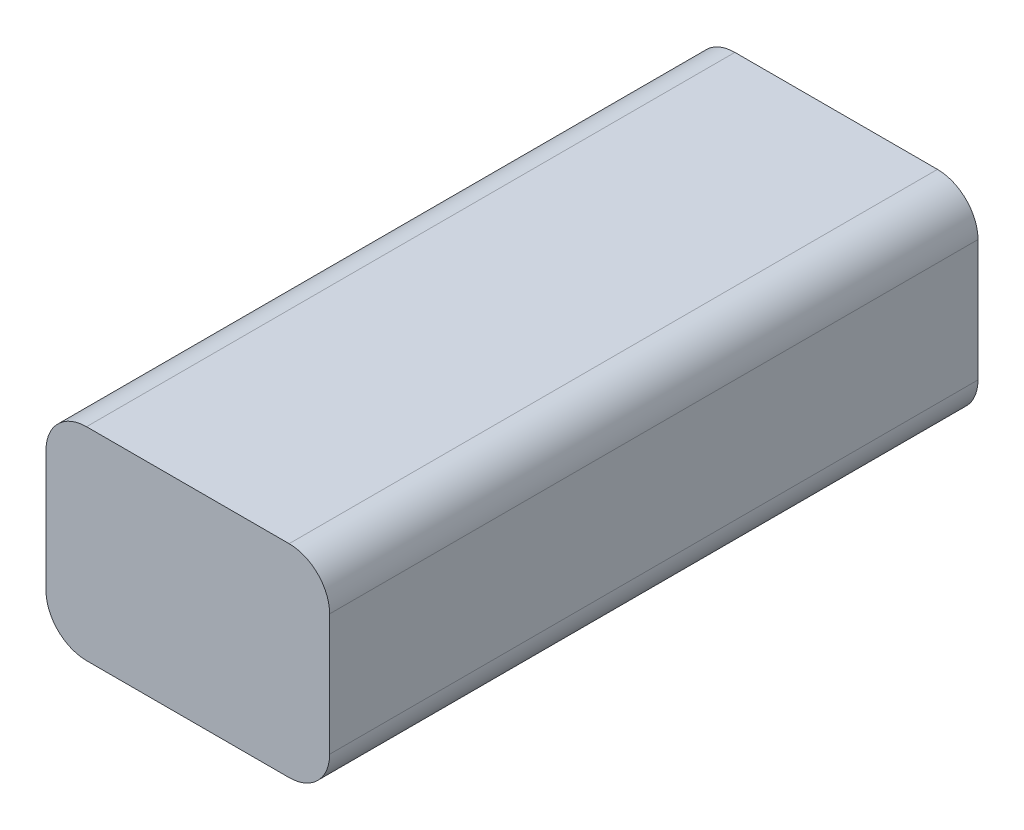
ISO-10303-21;
HEADER;
FILE_DESCRIPTION(('STEP AP214'),'2;1');
FILE_NAME('part.step','',(''),(''),'','','');
FILE_SCHEMA(('AUTOMOTIVE_DESIGN { 1 0 10303 214 1 1 1 1 }'));
ENDSEC;
DATA;
#1=APPLICATION_CONTEXT('core data for automotive mechanical design processes');
#2=APPLICATION_PROTOCOL_DEFINITION('international standard','automotive_design',2000,#1);
#3=PRODUCT_CONTEXT('',#1,'mechanical');
#4=PRODUCT('Part','Part','',(#3));
#5=PRODUCT_RELATED_PRODUCT_CATEGORY('part','',(#4));
#6=PRODUCT_DEFINITION_FORMATION('','',#4);
#7=PRODUCT_DEFINITION_CONTEXT('part definition',#1,'design');
#8=PRODUCT_DEFINITION('design','',#6,#7);
#9=PRODUCT_DEFINITION_SHAPE('','',#8);
#10=(LENGTH_UNIT() NAMED_UNIT(*) SI_UNIT(.MILLI.,.METRE.));
#11=(NAMED_UNIT(*) PLANE_ANGLE_UNIT() SI_UNIT($,.RADIAN.));
#12=(NAMED_UNIT(*) SI_UNIT($,.STERADIAN.) SOLID_ANGLE_UNIT());
#13=UNCERTAINTY_MEASURE_WITH_UNIT(LENGTH_MEASURE(1.E-05),#10,'distance_accuracy_value','');
#14=(GEOMETRIC_REPRESENTATION_CONTEXT(3) GLOBAL_UNCERTAINTY_ASSIGNED_CONTEXT((#13)) GLOBAL_UNIT_ASSIGNED_CONTEXT((#10,
#11,#12)) REPRESENTATION_CONTEXT('',''));
#15=CARTESIAN_POINT('',(0.,0.,0.));
#16=DIRECTION('',(0.,0.,1.));
#17=DIRECTION('',(1.,0.,0.));
#18=AXIS2_PLACEMENT_3D('',#15,#16,#17);
#19=CARTESIAN_POINT('',(-25.,-15.,160.));
#20=DIRECTION('',(0.,0.,-1.));
#21=DIRECTION('',(-1.,0.,0.));
#22=AXIS2_PLACEMENT_3D('',#19,#20,#21);
#23=CYLINDRICAL_SURFACE('',#22,10.);
#24=CARTESIAN_POINT('',(-25.,-15.,0.));
#25=DIRECTION('',(0.,0.,1.));
#26=DIRECTION('',(1.,0.,0.));
#27=AXIS2_PLACEMENT_3D('',#24,#25,#26);
#28=CIRCLE('',#27,10.);
#29=CARTESIAN_POINT('',(-35.,-14.9999999999999,0.));
#30=VERTEX_POINT('',#29);
#31=CARTESIAN_POINT('',(-24.9999999999999,-25.,0.));
#32=VERTEX_POINT('',#31);
#33=EDGE_CURVE('E147',#30,#32,#28,.T.);
#34=ORIENTED_EDGE('',*,*,#33,.T.);
#35=DIRECTION('',(0.,0.,-1.));
#36=VECTOR('',#35,1.);
#37=CARTESIAN_POINT('',(-24.9999999999999,-25.,160.));
#38=LINE('',#37,#36);
#39=CARTESIAN_POINT('',(-24.9999999999999,-25.,160.));
#40=VERTEX_POINT('',#39);
#41=EDGE_CURVE('E11',#40,#32,#38,.T.);
#42=ORIENTED_EDGE('',*,*,#41,.F.);
#43=CARTESIAN_POINT('',(-25.,-15.,160.));
#44=DIRECTION('',(0.,0.,1.));
#45=DIRECTION('',(1.,0.,0.));
#46=AXIS2_PLACEMENT_3D('',#43,#44,#45);
#47=CIRCLE('',#46,10.);
#48=CARTESIAN_POINT('',(-35.,-14.9999999999999,160.));
#49=VERTEX_POINT('',#48);
#50=EDGE_CURVE('E166',#49,#40,#47,.T.);
#51=ORIENTED_EDGE('',*,*,#50,.F.);
#52=DIRECTION('',(0.,0.,-1.));
#53=VECTOR('',#52,1.);
#54=CARTESIAN_POINT('',(-35.,-14.9999999999999,160.));
#55=LINE('',#54,#53);
#56=EDGE_CURVE('E145',#49,#30,#55,.T.);
#57=ORIENTED_EDGE('',*,*,#56,.T.);
#58=EDGE_LOOP('',(#34,#42,#51,#57));
#59=FACE_BOUND('',#58,.T.);
#60=ADVANCED_FACE('F44',(#59),#23,.T.);
#61=CARTESIAN_POINT('',(-24.9999999999999,-25.,160.));
#62=DIRECTION('',(0.,1.,0.));
#63=DIRECTION('',(-1.,0.,0.));
#64=AXIS2_PLACEMENT_3D('',#61,#62,#63);
#65=PLANE('',#64);
#66=DIRECTION('',(1.,0.,0.));
#67=VECTOR('',#66,1.);
#68=CARTESIAN_POINT('',(-24.9999999999999,-25.,0.));
#69=LINE('',#68,#67);
#70=CARTESIAN_POINT('',(24.9999999999999,-25.,0.));
#71=VERTEX_POINT('',#70);
#72=EDGE_CURVE('E148',#32,#71,#69,.T.);
#73=ORIENTED_EDGE('',*,*,#72,.T.);
#74=DIRECTION('',(0.,0.,-1.));
#75=VECTOR('',#74,1.);
#76=CARTESIAN_POINT('',(24.9999999999999,-25.,160.));
#77=LINE('',#76,#75);
#78=CARTESIAN_POINT('',(24.9999999999999,-25.,160.));
#79=VERTEX_POINT('',#78);
#80=EDGE_CURVE('E53',#79,#71,#77,.T.);
#81=ORIENTED_EDGE('',*,*,#80,.F.);
#82=DIRECTION('',(1.,0.,0.));
#83=VECTOR('',#82,1.);
#84=CARTESIAN_POINT('',(-24.9999999999999,-25.,160.));
#85=LINE('',#84,#83);
#86=EDGE_CURVE('E103',#40,#79,#85,.T.);
#87=ORIENTED_EDGE('',*,*,#86,.F.);
#88=ORIENTED_EDGE('',*,*,#41,.T.);
#89=EDGE_LOOP('',(#73,#81,#87,#88));
#90=FACE_BOUND('',#89,.T.);
#91=ADVANCED_FACE('F215',(#90),#65,.F.);
#92=CARTESIAN_POINT('',(25.,-15.,160.));
#93=DIRECTION('',(0.,0.,-1.));
#94=DIRECTION('',(-1.,0.,0.));
#95=AXIS2_PLACEMENT_3D('',#92,#93,#94);
#96=CYLINDRICAL_SURFACE('',#95,10.);
#97=CARTESIAN_POINT('',(25.,-15.,0.));
#98=DIRECTION('',(0.,0.,1.));
#99=DIRECTION('',(1.,0.,0.));
#100=AXIS2_PLACEMENT_3D('',#97,#98,#99);
#101=CIRCLE('',#100,10.);
#102=CARTESIAN_POINT('',(35.,-14.9999999999999,0.));
#103=VERTEX_POINT('',#102);
#104=EDGE_CURVE('E155',#71,#103,#101,.T.);
#105=ORIENTED_EDGE('',*,*,#104,.T.);
#106=DIRECTION('',(0.,0.,-1.));
#107=VECTOR('',#106,1.);
#108=CARTESIAN_POINT('',(35.,-14.9999999999999,160.));
#109=LINE('',#108,#107);
#110=CARTESIAN_POINT('',(35.,-14.9999999999999,160.));
#111=VERTEX_POINT('',#110);
#112=EDGE_CURVE('E177',#111,#103,#109,.T.);
#113=ORIENTED_EDGE('',*,*,#112,.F.);
#114=CARTESIAN_POINT('',(25.,-15.,160.));
#115=DIRECTION('',(0.,0.,1.));
#116=DIRECTION('',(1.,0.,0.));
#117=AXIS2_PLACEMENT_3D('',#114,#115,#116);
#118=CIRCLE('',#117,10.);
#119=EDGE_CURVE('E188',#79,#111,#118,.T.);
#120=ORIENTED_EDGE('',*,*,#119,.F.);
#121=ORIENTED_EDGE('',*,*,#80,.T.);
#122=EDGE_LOOP('',(#105,#113,#120,#121));
#123=FACE_BOUND('',#122,.T.);
#124=ADVANCED_FACE('F190',(#123),#96,.T.);
#125=CARTESIAN_POINT('',(35.,14.9999999999999,160.));
#126=DIRECTION('',(-1.,0.,0.));
#127=DIRECTION('',(0.,0.,1.));
#128=AXIS2_PLACEMENT_3D('',#125,#126,#127);
#129=PLANE('',#128);
#130=DIRECTION('',(0.,1.,0.));
#131=VECTOR('',#130,1.);
#132=CARTESIAN_POINT('',(35.,14.9999999999999,0.));
#133=LINE('',#132,#131);
#134=CARTESIAN_POINT('',(35.,14.9999999999999,0.));
#135=VERTEX_POINT('',#134);
#136=EDGE_CURVE('E157',#103,#135,#133,.T.);
#137=ORIENTED_EDGE('',*,*,#136,.T.);
#138=DIRECTION('',(0.,0.,-1.));
#139=VECTOR('',#138,1.);
#140=CARTESIAN_POINT('',(35.,14.9999999999999,160.));
#141=LINE('',#140,#139);
#142=CARTESIAN_POINT('',(35.,14.9999999999999,160.));
#143=VERTEX_POINT('',#142);
#144=EDGE_CURVE('E172',#143,#135,#141,.T.);
#145=ORIENTED_EDGE('',*,*,#144,.F.);
#146=DIRECTION('',(0.,1.,0.));
#147=VECTOR('',#146,1.);
#148=CARTESIAN_POINT('',(35.,14.9999999999999,160.));
#149=LINE('',#148,#147);
#150=EDGE_CURVE('E205',#111,#143,#149,.T.);
#151=ORIENTED_EDGE('',*,*,#150,.F.);
#152=ORIENTED_EDGE('',*,*,#112,.T.);
#153=EDGE_LOOP('',(#137,#145,#151,#152));
#154=FACE_BOUND('',#153,.T.);
#155=ADVANCED_FACE('F199',(#154),#129,.F.);
#156=CARTESIAN_POINT('',(25.,15.,160.));
#157=DIRECTION('',(0.,0.,-1.));
#158=DIRECTION('',(-1.,0.,0.));
#159=AXIS2_PLACEMENT_3D('',#156,#157,#158);
#160=CYLINDRICAL_SURFACE('',#159,10.);
#161=CARTESIAN_POINT('',(25.,15.,0.));
#162=DIRECTION('',(0.,0.,1.));
#163=DIRECTION('',(-1.,0.,0.));
#164=AXIS2_PLACEMENT_3D('',#161,#162,#163);
#165=CIRCLE('',#164,10.);
#166=CARTESIAN_POINT('',(24.9999999999999,25.,0.));
#167=VERTEX_POINT('',#166);
#168=EDGE_CURVE('E159',#135,#167,#165,.T.);
#169=ORIENTED_EDGE('',*,*,#168,.T.);
#170=DIRECTION('',(0.,0.,-1.));
#171=VECTOR('',#170,1.);
#172=CARTESIAN_POINT('',(24.9999999999999,25.,160.));
#173=LINE('',#172,#171);
#174=CARTESIAN_POINT('',(24.9999999999999,25.,160.));
#175=VERTEX_POINT('',#174);
#176=EDGE_CURVE('E134',#175,#167,#173,.T.);
#177=ORIENTED_EDGE('',*,*,#176,.F.);
#178=CARTESIAN_POINT('',(25.,15.,160.));
#179=DIRECTION('',(0.,0.,1.));
#180=DIRECTION('',(-1.,0.,0.));
#181=AXIS2_PLACEMENT_3D('',#178,#179,#180);
#182=CIRCLE('',#181,10.);
#183=EDGE_CURVE('E125',#143,#175,#182,.T.);
#184=ORIENTED_EDGE('',*,*,#183,.F.);
#185=ORIENTED_EDGE('',*,*,#144,.T.);
#186=EDGE_LOOP('',(#169,#177,#184,#185));
#187=FACE_BOUND('',#186,.T.);
#188=ADVANCED_FACE('F198',(#187),#160,.T.);
#189=CARTESIAN_POINT('',(-24.9999999999999,25.,160.));
#190=DIRECTION('',(0.,-1.,0.));
#191=DIRECTION('',(0.,0.,-1.));
#192=AXIS2_PLACEMENT_3D('',#189,#190,#191);
#193=PLANE('',#192);
#194=DIRECTION('',(-1.,0.,0.));
#195=VECTOR('',#194,1.);
#196=CARTESIAN_POINT('',(-24.9999999999999,25.,0.));
#197=LINE('',#196,#195);
#198=CARTESIAN_POINT('',(-24.9999999999999,25.,0.));
#199=VERTEX_POINT('',#198);
#200=EDGE_CURVE('E133',#167,#199,#197,.T.);
#201=ORIENTED_EDGE('',*,*,#200,.T.);
#202=DIRECTION('',(0.,0.,-1.));
#203=VECTOR('',#202,1.);
#204=CARTESIAN_POINT('',(-24.9999999999999,25.,160.));
#205=LINE('',#204,#203);
#206=CARTESIAN_POINT('',(-24.9999999999999,25.,160.));
#207=VERTEX_POINT('',#206);
#208=EDGE_CURVE('E127',#207,#199,#205,.T.);
#209=ORIENTED_EDGE('',*,*,#208,.F.);
#210=DIRECTION('',(-1.,0.,0.));
#211=VECTOR('',#210,1.);
#212=CARTESIAN_POINT('',(-24.9999999999999,25.,160.));
#213=LINE('',#212,#211);
#214=EDGE_CURVE('E120',#175,#207,#213,.T.);
#215=ORIENTED_EDGE('',*,*,#214,.F.);
#216=ORIENTED_EDGE('',*,*,#176,.T.);
#217=EDGE_LOOP('',(#201,#209,#215,#216));
#218=FACE_BOUND('',#217,.T.);
#219=ADVANCED_FACE('F131',(#218),#193,.F.);
#220=CARTESIAN_POINT('',(-25.,15.,160.));
#221=DIRECTION('',(0.,0.,-1.));
#222=DIRECTION('',(-1.,0.,0.));
#223=AXIS2_PLACEMENT_3D('',#220,#221,#222);
#224=CYLINDRICAL_SURFACE('',#223,10.);
#225=CARTESIAN_POINT('',(-25.,15.,0.));
#226=DIRECTION('',(0.,0.,1.));
#227=DIRECTION('',(1.,0.,0.));
#228=AXIS2_PLACEMENT_3D('',#225,#226,#227);
#229=CIRCLE('',#228,10.);
#230=CARTESIAN_POINT('',(-35.,14.9999999999999,0.));
#231=VERTEX_POINT('',#230);
#232=EDGE_CURVE('E91',#199,#231,#229,.T.);
#233=ORIENTED_EDGE('',*,*,#232,.T.);
#234=DIRECTION('',(0.,0.,-1.));
#235=VECTOR('',#234,1.);
#236=CARTESIAN_POINT('',(-35.,14.9999999999999,160.));
#237=LINE('',#236,#235);
#238=CARTESIAN_POINT('',(-35.,14.9999999999999,160.));
#239=VERTEX_POINT('',#238);
#240=EDGE_CURVE('E136',#239,#231,#237,.T.);
#241=ORIENTED_EDGE('',*,*,#240,.F.);
#242=CARTESIAN_POINT('',(-25.,15.,160.));
#243=DIRECTION('',(0.,0.,1.));
#244=DIRECTION('',(1.,0.,0.));
#245=AXIS2_PLACEMENT_3D('',#242,#243,#244);
#246=CIRCLE('',#245,10.);
#247=EDGE_CURVE('E122',#207,#239,#246,.T.);
#248=ORIENTED_EDGE('',*,*,#247,.F.);
#249=ORIENTED_EDGE('',*,*,#208,.T.);
#250=EDGE_LOOP('',(#233,#241,#248,#249));
#251=FACE_BOUND('',#250,.T.);
#252=ADVANCED_FACE('F138',(#251),#224,.T.);
#253=CARTESIAN_POINT('',(-35.,14.9999999999999,160.));
#254=DIRECTION('',(1.,0.,0.));
#255=DIRECTION('',(0.,0.,-1.));
#256=AXIS2_PLACEMENT_3D('',#253,#254,#255);
#257=PLANE('',#256);
#258=DIRECTION('',(0.,-1.,0.));
#259=VECTOR('',#258,1.);
#260=CARTESIAN_POINT('',(-35.,14.9999999999999,0.));
#261=LINE('',#260,#259);
#262=EDGE_CURVE('E100',#231,#30,#261,.T.);
#263=ORIENTED_EDGE('',*,*,#262,.T.);
#264=ORIENTED_EDGE('',*,*,#56,.F.);
#265=DIRECTION('',(0.,-1.,0.));
#266=VECTOR('',#265,1.);
#267=CARTESIAN_POINT('',(-35.,14.9999999999999,160.));
#268=LINE('',#267,#266);
#269=EDGE_CURVE('E64',#239,#49,#268,.T.);
#270=ORIENTED_EDGE('',*,*,#269,.F.);
#271=ORIENTED_EDGE('',*,*,#240,.T.);
#272=EDGE_LOOP('',(#263,#264,#270,#271));
#273=FACE_BOUND('',#272,.T.);
#274=ADVANCED_FACE('F229',(#273),#257,.F.);
#275=CARTESIAN_POINT('',(-25.,-15.,160.));
#276=DIRECTION('',(0.,0.,1.));
#277=DIRECTION('',(1.,0.,0.));
#278=AXIS2_PLACEMENT_3D('',#275,#276,#277);
#279=PLANE('',#278);
#280=ORIENTED_EDGE('',*,*,#50,.T.);
#281=ORIENTED_EDGE('',*,*,#86,.T.);
#282=ORIENTED_EDGE('',*,*,#119,.T.);
#283=ORIENTED_EDGE('',*,*,#150,.T.);
#284=ORIENTED_EDGE('',*,*,#183,.T.);
#285=ORIENTED_EDGE('',*,*,#214,.T.);
#286=ORIENTED_EDGE('',*,*,#247,.T.);
#287=ORIENTED_EDGE('',*,*,#269,.T.);
#288=EDGE_LOOP('',(#280,#281,#282,#283,#284,#285,#286,#287));
#289=FACE_BOUND('',#288,.T.);
#290=ADVANCED_FACE('F118',(#289),#279,.T.);
#291=CARTESIAN_POINT('',(-25.,-15.,0.));
#292=DIRECTION('',(0.,0.,1.));
#293=DIRECTION('',(1.,0.,0.));
#294=AXIS2_PLACEMENT_3D('',#291,#292,#293);
#295=PLANE('',#294);
#296=ORIENTED_EDGE('',*,*,#33,.F.);
#297=ORIENTED_EDGE('',*,*,#262,.F.);
#298=ORIENTED_EDGE('',*,*,#232,.F.);
#299=ORIENTED_EDGE('',*,*,#200,.F.);
#300=ORIENTED_EDGE('',*,*,#168,.F.);
#301=ORIENTED_EDGE('',*,*,#136,.F.);
#302=ORIENTED_EDGE('',*,*,#104,.F.);
#303=ORIENTED_EDGE('',*,*,#72,.F.);
#304=EDGE_LOOP('',(#296,#297,#298,#299,#300,#301,#302,#303));
#305=FACE_BOUND('',#304,.T.);
#306=ADVANCED_FACE('F194',(#305),#295,.F.);
#307=CLOSED_SHELL('',(#60,#91,#124,#155,#188,#219,#252,#274,#290,#306));
#308=MANIFOLD_SOLID_BREP('B2',#307);
#309=ADVANCED_BREP_SHAPE_REPRESENTATION('',(#18,#308),#14);
#310=SHAPE_DEFINITION_REPRESENTATION(#9,#309);
ENDSEC;
END-ISO-10303-21;
